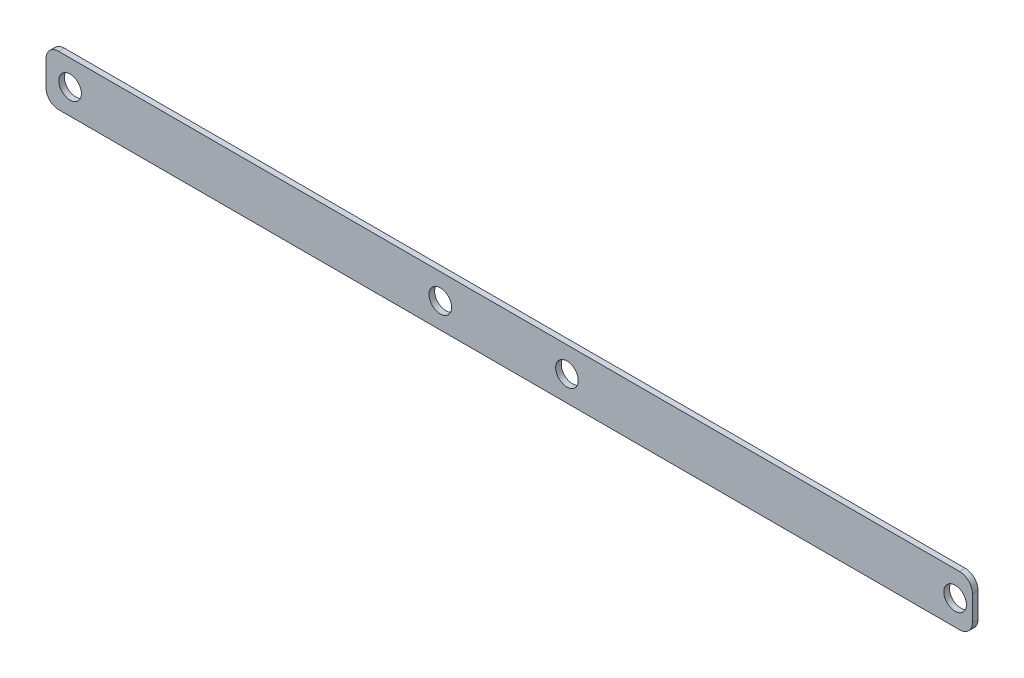
ISO-10303-21;
HEADER;
FILE_DESCRIPTION(('STEP AP214'),'2;1');
FILE_NAME('part.step','',(''),(''),'','','');
FILE_SCHEMA(('AUTOMOTIVE_DESIGN { 1 0 10303 214 1 1 1 1 }'));
ENDSEC;
DATA;
#1=APPLICATION_CONTEXT('core data for automotive mechanical design processes');
#2=APPLICATION_PROTOCOL_DEFINITION('international standard','automotive_design',2000,#1);
#3=PRODUCT_CONTEXT('',#1,'mechanical');
#4=PRODUCT('Part','Part','',(#3));
#5=PRODUCT_RELATED_PRODUCT_CATEGORY('part','',(#4));
#6=PRODUCT_DEFINITION_FORMATION('','',#4);
#7=PRODUCT_DEFINITION_CONTEXT('part definition',#1,'design');
#8=PRODUCT_DEFINITION('design','',#6,#7);
#9=PRODUCT_DEFINITION_SHAPE('','',#8);
#10=(LENGTH_UNIT() NAMED_UNIT(*) SI_UNIT(.MILLI.,.METRE.));
#11=(NAMED_UNIT(*) PLANE_ANGLE_UNIT() SI_UNIT($,.RADIAN.));
#12=(NAMED_UNIT(*) SI_UNIT($,.STERADIAN.) SOLID_ANGLE_UNIT());
#13=UNCERTAINTY_MEASURE_WITH_UNIT(LENGTH_MEASURE(1.E-05),#10,'distance_accuracy_value','');
#14=(GEOMETRIC_REPRESENTATION_CONTEXT(3) GLOBAL_UNCERTAINTY_ASSIGNED_CONTEXT((#13)) GLOBAL_UNIT_ASSIGNED_CONTEXT((#10,
#11,#12)) REPRESENTATION_CONTEXT('',''));
#15=CARTESIAN_POINT('',(0.,0.,0.));
#16=DIRECTION('',(0.,0.,1.));
#17=DIRECTION('',(1.,0.,0.));
#18=AXIS2_PLACEMENT_3D('',#15,#16,#17);
#19=CARTESIAN_POINT('',(-156.117488594139,-2.35958307004256,2.));
#20=DIRECTION('',(0.,0.,-1.));
#21=DIRECTION('',(-1.,0.,0.));
#22=AXIS2_PLACEMENT_3D('',#19,#20,#21);
#23=PLANE('',#22);
#24=CARTESIAN_POINT('',(-156.117488594139,-2.35958307004256,2.));
#25=DIRECTION('',(0.,0.,1.));
#26=DIRECTION('',(-1.,0.,0.));
#27=AXIS2_PLACEMENT_3D('',#24,#25,#26);
#28=CIRCLE('',#27,4.50000000000001);
#29=CARTESIAN_POINT('',(-156.11748859414,2.14041692995746,2.));
#30=VERTEX_POINT('',#29);
#31=CARTESIAN_POINT('',(-160.61748859414,-2.35958307004256,2.));
#32=VERTEX_POINT('',#31);
#33=EDGE_CURVE('E259',#30,#32,#28,.T.);
#34=ORIENTED_EDGE('',*,*,#33,.T.);
#35=DIRECTION('',(0.,-1.,0.));
#36=VECTOR('',#35,1.);
#37=CARTESIAN_POINT('',(-160.61748859414,-11.3595830700426,2.));
#38=LINE('',#37,#36);
#39=CARTESIAN_POINT('',(-160.61748859414,-11.3595830700425,2.));
#40=VERTEX_POINT('',#39);
#41=EDGE_CURVE('E209',#32,#40,#38,.T.);
#42=ORIENTED_EDGE('',*,*,#41,.T.);
#43=CARTESIAN_POINT('',(-156.117488594139,-11.3595830700425,2.));
#44=DIRECTION('',(0.,0.,1.));
#45=DIRECTION('',(-1.,0.,0.));
#46=AXIS2_PLACEMENT_3D('',#43,#44,#45);
#47=CIRCLE('',#46,4.50000000000001);
#48=CARTESIAN_POINT('',(-156.117488594139,-15.8595830700425,2.));
#49=VERTEX_POINT('',#48);
#50=EDGE_CURVE('E274',#40,#49,#47,.T.);
#51=ORIENTED_EDGE('',*,*,#50,.T.);
#52=DIRECTION('',(1.,0.,0.));
#53=VECTOR('',#52,1.);
#54=CARTESIAN_POINT('',(164.882511405861,-15.8595830700425,2.));
#55=LINE('',#54,#53);
#56=CARTESIAN_POINT('',(164.882511405861,-15.8595830700425,2.));
#57=VERTEX_POINT('',#56);
#58=EDGE_CURVE('E289',#49,#57,#55,.T.);
#59=ORIENTED_EDGE('',*,*,#58,.T.);
#60=CARTESIAN_POINT('',(164.88251140586,-11.3595830700425,2.));
#61=DIRECTION('',(0.,0.,1.));
#62=DIRECTION('',(-1.,0.,0.));
#63=AXIS2_PLACEMENT_3D('',#60,#61,#62);
#64=CIRCLE('',#63,4.50000000000004);
#65=CARTESIAN_POINT('',(169.38251140586,-11.3595830700425,2.));
#66=VERTEX_POINT('',#65);
#67=EDGE_CURVE('E230',#57,#66,#64,.T.);
#68=ORIENTED_EDGE('',*,*,#67,.T.);
#69=DIRECTION('',(0.,1.,0.));
#70=VECTOR('',#69,1.);
#71=CARTESIAN_POINT('',(169.38251140586,-2.35958307004253,2.));
#72=LINE('',#71,#70);
#73=CARTESIAN_POINT('',(169.38251140586,-2.35958307004253,2.));
#74=VERTEX_POINT('',#73);
#75=EDGE_CURVE('E221',#66,#74,#72,.T.);
#76=ORIENTED_EDGE('',*,*,#75,.T.);
#77=CARTESIAN_POINT('',(164.882511405861,-2.35958307004247,2.));
#78=DIRECTION('',(0.,0.,1.));
#79=DIRECTION('',(-1.,0.,0.));
#80=AXIS2_PLACEMENT_3D('',#77,#78,#79);
#81=CIRCLE('',#80,4.49999999999996);
#82=CARTESIAN_POINT('',(164.882511405861,2.14041692995749,2.));
#83=VERTEX_POINT('',#82);
#84=EDGE_CURVE('E224',#74,#83,#81,.T.);
#85=ORIENTED_EDGE('',*,*,#84,.T.);
#86=DIRECTION('',(-1.,0.,0.));
#87=VECTOR('',#86,1.);
#88=CARTESIAN_POINT('',(-156.11748859414,2.14041692995746,2.));
#89=LINE('',#88,#87);
#90=EDGE_CURVE('E165',#83,#30,#89,.T.);
#91=ORIENTED_EDGE('',*,*,#90,.T.);
#92=EDGE_LOOP('',(#34,#42,#51,#59,#68,#76,#85,#91));
#93=FACE_BOUND('',#92,.T.);
#94=CARTESIAN_POINT('',(-20.1514565612795,-6.87630042393008,2.));
#95=DIRECTION('',(0.,0.,1.));
#96=DIRECTION('',(1.,0.,0.));
#97=AXIS2_PLACEMENT_3D('',#94,#95,#96);
#98=CIRCLE('',#97,4.025);
#99=CARTESIAN_POINT('',(-16.1264565612795,-6.87630042393008,2.));
#100=VERTEX_POINT('',#99);
#101=EDGE_CURVE('E249',#100,#100,#98,.T.);
#102=ORIENTED_EDGE('',*,*,#101,.F.);
#103=EDGE_LOOP('',(#102));
#104=FACE_BOUND('',#103,.T.);
#105=CARTESIAN_POINT('',(24.9544228028114,-6.88253265885584,2.));
#106=DIRECTION('',(0.,0.,1.));
#107=DIRECTION('',(1.,0.,0.));
#108=AXIS2_PLACEMENT_3D('',#105,#106,#107);
#109=CIRCLE('',#108,4.025);
#110=CARTESIAN_POINT('',(28.9794228028114,-6.88253265885584,2.));
#111=VERTEX_POINT('',#110);
#112=EDGE_CURVE('E297',#111,#111,#109,.T.);
#113=ORIENTED_EDGE('',*,*,#112,.F.);
#114=EDGE_LOOP('',(#113));
#115=FACE_BOUND('',#114,.T.);
#116=CARTESIAN_POINT('',(163.241625749099,-6.90163970390415,2.));
#117=DIRECTION('',(0.,0.,1.));
#118=DIRECTION('',(1.,0.,0.));
#119=AXIS2_PLACEMENT_3D('',#116,#117,#118);
#120=CIRCLE('',#119,4.025);
#121=CARTESIAN_POINT('',(167.266625749099,-6.90163970390415,2.));
#122=VERTEX_POINT('',#121);
#123=EDGE_CURVE('E301',#122,#122,#120,.T.);
#124=ORIENTED_EDGE('',*,*,#123,.F.);
#125=EDGE_LOOP('',(#124));
#126=FACE_BOUND('',#125,.T.);
#127=CARTESIAN_POINT('',(-152.036053327265,-6.85807809751156,2.));
#128=DIRECTION('',(0.,0.,1.));
#129=DIRECTION('',(1.,0.,0.));
#130=AXIS2_PLACEMENT_3D('',#127,#128,#129);
#131=CIRCLE('',#130,4.025);
#132=CARTESIAN_POINT('',(-148.011053327265,-6.85807809751156,2.));
#133=VERTEX_POINT('',#132);
#134=EDGE_CURVE('E309',#133,#133,#131,.T.);
#135=ORIENTED_EDGE('',*,*,#134,.F.);
#136=EDGE_LOOP('',(#135));
#137=FACE_BOUND('',#136,.T.);
#138=ADVANCED_FACE('F149',(#93,#104,#115,#126,#137),#23,.F.);
#139=CARTESIAN_POINT('',(-156.117488594139,-2.35958307004256,0.));
#140=DIRECTION('',(0.,0.,-1.));
#141=DIRECTION('',(-1.,0.,0.));
#142=AXIS2_PLACEMENT_3D('',#139,#140,#141);
#143=PLANE('',#142);
#144=CARTESIAN_POINT('',(163.241625749099,-6.90163970390415,0.));
#145=DIRECTION('',(0.,0.,1.));
#146=DIRECTION('',(1.,0.,0.));
#147=AXIS2_PLACEMENT_3D('',#144,#145,#146);
#148=CIRCLE('',#147,4.025);
#149=CARTESIAN_POINT('',(167.266625749099,-6.90163970390415,0.));
#150=VERTEX_POINT('',#149);
#151=EDGE_CURVE('E308',#150,#150,#148,.T.);
#152=ORIENTED_EDGE('',*,*,#151,.T.);
#153=EDGE_LOOP('',(#152));
#154=FACE_BOUND('',#153,.T.);
#155=CARTESIAN_POINT('',(-20.1514565612795,-6.87630042393008,0.));
#156=DIRECTION('',(0.,0.,1.));
#157=DIRECTION('',(1.,0.,0.));
#158=AXIS2_PLACEMENT_3D('',#155,#156,#157);
#159=CIRCLE('',#158,4.025);
#160=CARTESIAN_POINT('',(-16.1264565612795,-6.87630042393008,0.));
#161=VERTEX_POINT('',#160);
#162=EDGE_CURVE('E294',#161,#161,#159,.T.);
#163=ORIENTED_EDGE('',*,*,#162,.T.);
#164=EDGE_LOOP('',(#163));
#165=FACE_BOUND('',#164,.T.);
#166=CARTESIAN_POINT('',(-156.117488594139,-2.35958307004256,0.));
#167=DIRECTION('',(0.,0.,1.));
#168=DIRECTION('',(-1.,0.,0.));
#169=AXIS2_PLACEMENT_3D('',#166,#167,#168);
#170=CIRCLE('',#169,4.50000000000001);
#171=CARTESIAN_POINT('',(-156.11748859414,2.14041692995746,0.));
#172=VERTEX_POINT('',#171);
#173=CARTESIAN_POINT('',(-160.61748859414,-2.35958307004256,0.));
#174=VERTEX_POINT('',#173);
#175=EDGE_CURVE('E245',#172,#174,#170,.T.);
#176=ORIENTED_EDGE('',*,*,#175,.F.);
#177=DIRECTION('',(-1.,0.,0.));
#178=VECTOR('',#177,1.);
#179=CARTESIAN_POINT('',(-156.11748859414,2.14041692995746,0.));
#180=LINE('',#179,#178);
#181=CARTESIAN_POINT('',(164.882511405861,2.14041692995749,0.));
#182=VERTEX_POINT('',#181);
#183=EDGE_CURVE('E200',#182,#172,#180,.T.);
#184=ORIENTED_EDGE('',*,*,#183,.F.);
#185=CARTESIAN_POINT('',(164.882511405861,-2.35958307004247,0.));
#186=DIRECTION('',(0.,0.,1.));
#187=DIRECTION('',(-1.,0.,0.));
#188=AXIS2_PLACEMENT_3D('',#185,#186,#187);
#189=CIRCLE('',#188,4.49999999999996);
#190=CARTESIAN_POINT('',(169.38251140586,-2.35958307004253,0.));
#191=VERTEX_POINT('',#190);
#192=EDGE_CURVE('E191',#191,#182,#189,.T.);
#193=ORIENTED_EDGE('',*,*,#192,.F.);
#194=DIRECTION('',(0.,1.,0.));
#195=VECTOR('',#194,1.);
#196=CARTESIAN_POINT('',(169.38251140586,-2.35958307004253,0.));
#197=LINE('',#196,#195);
#198=CARTESIAN_POINT('',(169.38251140586,-11.3595830700425,0.));
#199=VERTEX_POINT('',#198);
#200=EDGE_CURVE('E234',#199,#191,#197,.T.);
#201=ORIENTED_EDGE('',*,*,#200,.F.);
#202=CARTESIAN_POINT('',(164.88251140586,-11.3595830700425,0.));
#203=DIRECTION('',(0.,0.,1.));
#204=DIRECTION('',(-1.,0.,0.));
#205=AXIS2_PLACEMENT_3D('',#202,#203,#204);
#206=CIRCLE('',#205,4.50000000000004);
#207=CARTESIAN_POINT('',(164.882511405861,-15.8595830700425,0.));
#208=VERTEX_POINT('',#207);
#209=EDGE_CURVE('E255',#208,#199,#206,.T.);
#210=ORIENTED_EDGE('',*,*,#209,.F.);
#211=DIRECTION('',(1.,0.,0.));
#212=VECTOR('',#211,1.);
#213=CARTESIAN_POINT('',(164.882511405861,-15.8595830700425,0.));
#214=LINE('',#213,#212);
#215=CARTESIAN_POINT('',(-156.117488594139,-15.8595830700425,0.));
#216=VERTEX_POINT('',#215);
#217=EDGE_CURVE('E254',#216,#208,#214,.T.);
#218=ORIENTED_EDGE('',*,*,#217,.F.);
#219=CARTESIAN_POINT('',(-156.117488594139,-11.3595830700425,0.));
#220=DIRECTION('',(0.,0.,1.));
#221=DIRECTION('',(-1.,0.,0.));
#222=AXIS2_PLACEMENT_3D('',#219,#220,#221);
#223=CIRCLE('',#222,4.50000000000001);
#224=CARTESIAN_POINT('',(-160.61748859414,-11.3595830700425,0.));
#225=VERTEX_POINT('',#224);
#226=EDGE_CURVE('E251',#225,#216,#223,.T.);
#227=ORIENTED_EDGE('',*,*,#226,.F.);
#228=DIRECTION('',(0.,-1.,0.));
#229=VECTOR('',#228,1.);
#230=CARTESIAN_POINT('',(-160.61748859414,-11.3595830700426,0.));
#231=LINE('',#230,#229);
#232=EDGE_CURVE('E246',#174,#225,#231,.T.);
#233=ORIENTED_EDGE('',*,*,#232,.F.);
#234=EDGE_LOOP('',(#176,#184,#193,#201,#210,#218,#227,#233));
#235=FACE_BOUND('',#234,.T.);
#236=CARTESIAN_POINT('',(24.9544228028114,-6.88253265885584,0.));
#237=DIRECTION('',(0.,0.,1.));
#238=DIRECTION('',(1.,0.,0.));
#239=AXIS2_PLACEMENT_3D('',#236,#237,#238);
#240=CIRCLE('',#239,4.025);
#241=CARTESIAN_POINT('',(28.9794228028114,-6.88253265885584,0.));
#242=VERTEX_POINT('',#241);
#243=EDGE_CURVE('E300',#242,#242,#240,.T.);
#244=ORIENTED_EDGE('',*,*,#243,.T.);
#245=EDGE_LOOP('',(#244));
#246=FACE_BOUND('',#245,.T.);
#247=CARTESIAN_POINT('',(-152.036053327265,-6.85807809751156,0.));
#248=DIRECTION('',(0.,0.,1.));
#249=DIRECTION('',(1.,0.,0.));
#250=AXIS2_PLACEMENT_3D('',#247,#248,#249);
#251=CIRCLE('',#250,4.025);
#252=CARTESIAN_POINT('',(-148.011053327265,-6.85807809751156,0.));
#253=VERTEX_POINT('',#252);
#254=EDGE_CURVE('E315',#253,#253,#251,.T.);
#255=ORIENTED_EDGE('',*,*,#254,.T.);
#256=EDGE_LOOP('',(#255));
#257=FACE_BOUND('',#256,.T.);
#258=ADVANCED_FACE('F278',(#154,#165,#235,#246,#257),#143,.T.);
#259=CARTESIAN_POINT('',(-156.117488594139,-2.35958307004256,2.));
#260=DIRECTION('',(0.,0.,-1.));
#261=DIRECTION('',(-1.,0.,0.));
#262=AXIS2_PLACEMENT_3D('',#259,#260,#261);
#263=CYLINDRICAL_SURFACE('',#262,4.50000000000001);
#264=ORIENTED_EDGE('',*,*,#175,.T.);
#265=DIRECTION('',(0.,0.,-1.));
#266=VECTOR('',#265,1.);
#267=CARTESIAN_POINT('',(-160.61748859414,-2.35958307004256,2.));
#268=LINE('',#267,#266);
#269=EDGE_CURVE('E12',#32,#174,#268,.T.);
#270=ORIENTED_EDGE('',*,*,#269,.F.);
#271=ORIENTED_EDGE('',*,*,#33,.F.);
#272=DIRECTION('',(0.,0.,-1.));
#273=VECTOR('',#272,1.);
#274=CARTESIAN_POINT('',(-156.11748859414,2.14041692995746,2.));
#275=LINE('',#274,#273);
#276=EDGE_CURVE('E241',#30,#172,#275,.T.);
#277=ORIENTED_EDGE('',*,*,#276,.T.);
#278=EDGE_LOOP('',(#264,#270,#271,#277));
#279=FACE_BOUND('',#278,.T.);
#280=ADVANCED_FACE('F148',(#279),#263,.T.);
#281=CARTESIAN_POINT('',(-160.61748859414,-11.3595830700426,2.));
#282=DIRECTION('',(1.,0.,0.));
#283=DIRECTION('',(0.,0.,-1.));
#284=AXIS2_PLACEMENT_3D('',#281,#282,#283);
#285=PLANE('',#284);
#286=ORIENTED_EDGE('',*,*,#232,.T.);
#287=DIRECTION('',(0.,0.,-1.));
#288=VECTOR('',#287,1.);
#289=CARTESIAN_POINT('',(-160.61748859414,-11.3595830700425,2.));
#290=LINE('',#289,#288);
#291=EDGE_CURVE('E160',#40,#225,#290,.T.);
#292=ORIENTED_EDGE('',*,*,#291,.F.);
#293=ORIENTED_EDGE('',*,*,#41,.F.);
#294=ORIENTED_EDGE('',*,*,#269,.T.);
#295=EDGE_LOOP('',(#286,#292,#293,#294));
#296=FACE_BOUND('',#295,.T.);
#297=ADVANCED_FACE('F343',(#296),#285,.F.);
#298=CARTESIAN_POINT('',(-156.117488594139,-11.3595830700425,2.));
#299=DIRECTION('',(0.,0.,-1.));
#300=DIRECTION('',(-1.,0.,0.));
#301=AXIS2_PLACEMENT_3D('',#298,#299,#300);
#302=CYLINDRICAL_SURFACE('',#301,4.50000000000001);
#303=ORIENTED_EDGE('',*,*,#226,.T.);
#304=DIRECTION('',(0.,0.,-1.));
#305=VECTOR('',#304,1.);
#306=CARTESIAN_POINT('',(-156.117488594139,-15.8595830700425,2.));
#307=LINE('',#306,#305);
#308=EDGE_CURVE('E270',#49,#216,#307,.T.);
#309=ORIENTED_EDGE('',*,*,#308,.F.);
#310=ORIENTED_EDGE('',*,*,#50,.F.);
#311=ORIENTED_EDGE('',*,*,#291,.T.);
#312=EDGE_LOOP('',(#303,#309,#310,#311));
#313=FACE_BOUND('',#312,.T.);
#314=ADVANCED_FACE('F273',(#313),#302,.T.);
#315=CARTESIAN_POINT('',(164.882511405861,-15.8595830700425,2.));
#316=DIRECTION('',(0.,1.,0.));
#317=DIRECTION('',(-1.,0.,0.));
#318=AXIS2_PLACEMENT_3D('',#315,#316,#317);
#319=PLANE('',#318);
#320=ORIENTED_EDGE('',*,*,#217,.T.);
#321=DIRECTION('',(0.,0.,-1.));
#322=VECTOR('',#321,1.);
#323=CARTESIAN_POINT('',(164.882511405861,-15.8595830700425,2.));
#324=LINE('',#323,#322);
#325=EDGE_CURVE('E264',#57,#208,#324,.T.);
#326=ORIENTED_EDGE('',*,*,#325,.F.);
#327=ORIENTED_EDGE('',*,*,#58,.F.);
#328=ORIENTED_EDGE('',*,*,#308,.T.);
#329=EDGE_LOOP('',(#320,#326,#327,#328));
#330=FACE_BOUND('',#329,.T.);
#331=ADVANCED_FACE('F281',(#330),#319,.F.);
#332=CARTESIAN_POINT('',(164.88251140586,-11.3595830700425,2.));
#333=DIRECTION('',(0.,0.,-1.));
#334=DIRECTION('',(-1.,0.,0.));
#335=AXIS2_PLACEMENT_3D('',#332,#333,#334);
#336=CYLINDRICAL_SURFACE('',#335,4.50000000000004);
#337=ORIENTED_EDGE('',*,*,#209,.T.);
#338=DIRECTION('',(0.,0.,-1.));
#339=VECTOR('',#338,1.);
#340=CARTESIAN_POINT('',(169.38251140586,-11.3595830700425,2.));
#341=LINE('',#340,#339);
#342=EDGE_CURVE('E237',#66,#199,#341,.T.);
#343=ORIENTED_EDGE('',*,*,#342,.F.);
#344=ORIENTED_EDGE('',*,*,#67,.F.);
#345=ORIENTED_EDGE('',*,*,#325,.T.);
#346=EDGE_LOOP('',(#337,#343,#344,#345));
#347=FACE_BOUND('',#346,.T.);
#348=ADVANCED_FACE('F287',(#347),#336,.T.);
#349=CARTESIAN_POINT('',(169.38251140586,-2.35958307004253,2.));
#350=DIRECTION('',(-1.,0.,0.));
#351=DIRECTION('',(0.,0.,1.));
#352=AXIS2_PLACEMENT_3D('',#349,#350,#351);
#353=PLANE('',#352);
#354=ORIENTED_EDGE('',*,*,#200,.T.);
#355=DIRECTION('',(0.,0.,-1.));
#356=VECTOR('',#355,1.);
#357=CARTESIAN_POINT('',(169.38251140586,-2.35958307004253,2.));
#358=LINE('',#357,#356);
#359=EDGE_CURVE('E235',#74,#191,#358,.T.);
#360=ORIENTED_EDGE('',*,*,#359,.F.);
#361=ORIENTED_EDGE('',*,*,#75,.F.);
#362=ORIENTED_EDGE('',*,*,#342,.T.);
#363=EDGE_LOOP('',(#354,#360,#361,#362));
#364=FACE_BOUND('',#363,.T.);
#365=ADVANCED_FACE('F232',(#364),#353,.F.);
#366=CARTESIAN_POINT('',(164.882511405861,-2.35958307004247,2.));
#367=DIRECTION('',(0.,0.,-1.));
#368=DIRECTION('',(-1.,0.,0.));
#369=AXIS2_PLACEMENT_3D('',#366,#367,#368);
#370=CYLINDRICAL_SURFACE('',#369,4.49999999999996);
#371=ORIENTED_EDGE('',*,*,#192,.T.);
#372=DIRECTION('',(0.,0.,-1.));
#373=VECTOR('',#372,1.);
#374=CARTESIAN_POINT('',(164.882511405861,2.14041692995749,2.));
#375=LINE('',#374,#373);
#376=EDGE_CURVE('E240',#83,#182,#375,.T.);
#377=ORIENTED_EDGE('',*,*,#376,.F.);
#378=ORIENTED_EDGE('',*,*,#84,.F.);
#379=ORIENTED_EDGE('',*,*,#359,.T.);
#380=EDGE_LOOP('',(#371,#377,#378,#379));
#381=FACE_BOUND('',#380,.T.);
#382=ADVANCED_FACE('F236',(#381),#370,.T.);
#383=CARTESIAN_POINT('',(-156.11748859414,2.14041692995746,2.));
#384=DIRECTION('',(0.,-1.,0.));
#385=DIRECTION('',(1.,0.,0.));
#386=AXIS2_PLACEMENT_3D('',#383,#384,#385);
#387=PLANE('',#386);
#388=ORIENTED_EDGE('',*,*,#183,.T.);
#389=ORIENTED_EDGE('',*,*,#276,.F.);
#390=ORIENTED_EDGE('',*,*,#90,.F.);
#391=ORIENTED_EDGE('',*,*,#376,.T.);
#392=EDGE_LOOP('',(#388,#389,#390,#391));
#393=FACE_BOUND('',#392,.T.);
#394=ADVANCED_FACE('F332',(#393),#387,.F.);
#395=CARTESIAN_POINT('',(-20.1514565612795,-6.87630042393008,2.));
#396=DIRECTION('',(0.,0.,-1.));
#397=DIRECTION('',(-1.,0.,0.));
#398=AXIS2_PLACEMENT_3D('',#395,#396,#397);
#399=CYLINDRICAL_SURFACE('',#398,4.025);
#400=ORIENTED_EDGE('',*,*,#101,.T.);
#401=EDGE_LOOP('',(#400));
#402=FACE_BOUND('',#401,.T.);
#403=ORIENTED_EDGE('',*,*,#162,.F.);
#404=EDGE_LOOP('',(#403));
#405=FACE_BOUND('',#404,.T.);
#406=ADVANCED_FACE('F326',(#402,#405),#399,.F.);
#407=CARTESIAN_POINT('',(24.9544228028114,-6.88253265885584,2.));
#408=DIRECTION('',(0.,0.,-1.));
#409=DIRECTION('',(-1.,0.,0.));
#410=AXIS2_PLACEMENT_3D('',#407,#408,#409);
#411=CYLINDRICAL_SURFACE('',#410,4.025);
#412=ORIENTED_EDGE('',*,*,#112,.T.);
#413=EDGE_LOOP('',(#412));
#414=FACE_BOUND('',#413,.T.);
#415=ORIENTED_EDGE('',*,*,#243,.F.);
#416=EDGE_LOOP('',(#415));
#417=FACE_BOUND('',#416,.T.);
#418=ADVANCED_FACE('F410',(#414,#417),#411,.F.);
#419=CARTESIAN_POINT('',(163.241625749099,-6.90163970390415,2.));
#420=DIRECTION('',(0.,0.,-1.));
#421=DIRECTION('',(-1.,0.,0.));
#422=AXIS2_PLACEMENT_3D('',#419,#420,#421);
#423=CYLINDRICAL_SURFACE('',#422,4.025);
#424=ORIENTED_EDGE('',*,*,#123,.T.);
#425=EDGE_LOOP('',(#424));
#426=FACE_BOUND('',#425,.T.);
#427=ORIENTED_EDGE('',*,*,#151,.F.);
#428=EDGE_LOOP('',(#427));
#429=FACE_BOUND('',#428,.T.);
#430=ADVANCED_FACE('F414',(#426,#429),#423,.F.);
#431=CARTESIAN_POINT('',(-152.036053327265,-6.85807809751156,2.));
#432=DIRECTION('',(0.,0.,-1.));
#433=DIRECTION('',(-1.,0.,0.));
#434=AXIS2_PLACEMENT_3D('',#431,#432,#433);
#435=CYLINDRICAL_SURFACE('',#434,4.025);
#436=ORIENTED_EDGE('',*,*,#134,.T.);
#437=EDGE_LOOP('',(#436));
#438=FACE_BOUND('',#437,.T.);
#439=ORIENTED_EDGE('',*,*,#254,.F.);
#440=EDGE_LOOP('',(#439));
#441=FACE_BOUND('',#440,.T.);
#442=ADVANCED_FACE('F318',(#438,#441),#435,.F.);
#443=CLOSED_SHELL('',(#138,#258,#280,#297,#314,#331,#348,#365,#382,#394,#406,#418,#430,#442));
#444=MANIFOLD_SOLID_BREP('B2',#443);
#445=ADVANCED_BREP_SHAPE_REPRESENTATION('',(#18,#444),#14);
#446=SHAPE_DEFINITION_REPRESENTATION(#9,#445);
ENDSEC;
END-ISO-10303-21;
